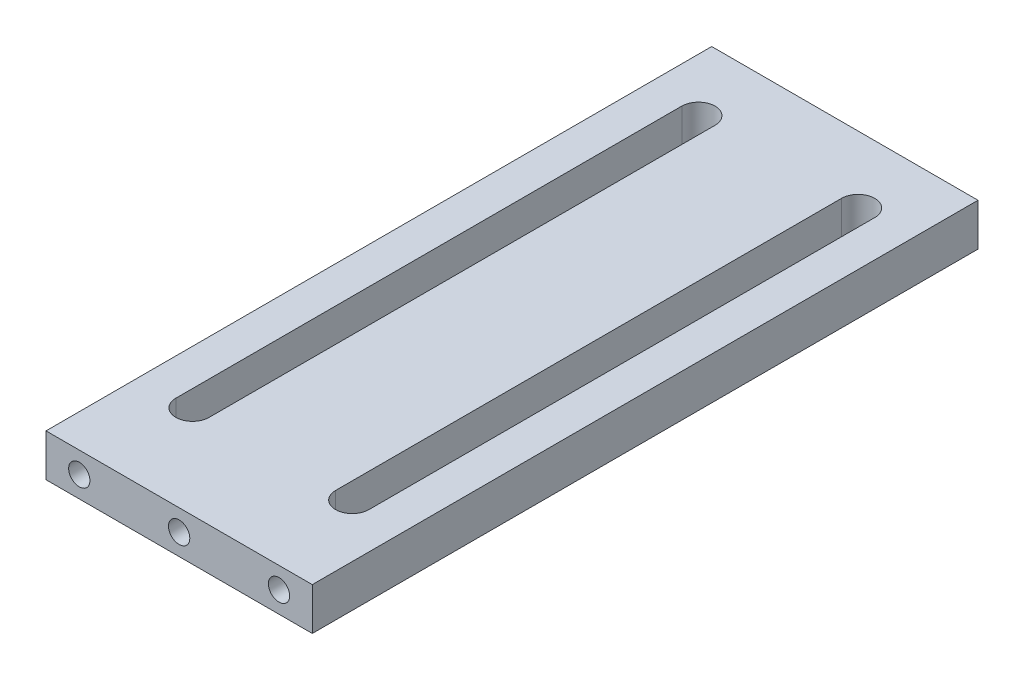
ISO-10303-21;
HEADER;
FILE_DESCRIPTION(('STEP AP214'),'2;1');
FILE_NAME('part.step','',(''),(''),'','','');
FILE_SCHEMA(('AUTOMOTIVE_DESIGN { 1 0 10303 214 1 1 1 1 }'));
ENDSEC;
DATA;
#1=APPLICATION_CONTEXT('core data for automotive mechanical design processes');
#2=APPLICATION_PROTOCOL_DEFINITION('international standard','automotive_design',2000,#1);
#3=PRODUCT_CONTEXT('',#1,'mechanical');
#4=PRODUCT('Part','Part','',(#3));
#5=PRODUCT_RELATED_PRODUCT_CATEGORY('part','',(#4));
#6=PRODUCT_DEFINITION_FORMATION('','',#4);
#7=PRODUCT_DEFINITION_CONTEXT('part definition',#1,'design');
#8=PRODUCT_DEFINITION('design','',#6,#7);
#9=PRODUCT_DEFINITION_SHAPE('','',#8);
#10=(LENGTH_UNIT() NAMED_UNIT(*) SI_UNIT(.MILLI.,.METRE.));
#11=(NAMED_UNIT(*) PLANE_ANGLE_UNIT() SI_UNIT($,.RADIAN.));
#12=(NAMED_UNIT(*) SI_UNIT($,.STERADIAN.) SOLID_ANGLE_UNIT());
#13=UNCERTAINTY_MEASURE_WITH_UNIT(LENGTH_MEASURE(1.E-05),#10,'distance_accuracy_value','');
#14=(GEOMETRIC_REPRESENTATION_CONTEXT(3) GLOBAL_UNCERTAINTY_ASSIGNED_CONTEXT((#13)) GLOBAL_UNIT_ASSIGNED_CONTEXT((#10,
#11,#12)) REPRESENTATION_CONTEXT('',''));
#15=CARTESIAN_POINT('',(0.,0.,0.));
#16=DIRECTION('',(0.,0.,1.));
#17=DIRECTION('',(1.,0.,0.));
#18=AXIS2_PLACEMENT_3D('',#15,#16,#17);
#19=CARTESIAN_POINT('',(0.,3.18,0.));
#20=DIRECTION('',(0.,-1.,0.));
#21=DIRECTION('',(0.,0.,-1.));
#22=AXIS2_PLACEMENT_3D('',#19,#20,#21);
#23=PLANE('',#22);
#24=DIRECTION('',(0.,0.,1.));
#25=VECTOR('',#24,1.);
#26=CARTESIAN_POINT('',(0.,3.18,0.));
#27=LINE('',#26,#25);
#28=CARTESIAN_POINT('',(0.,3.18,-50.));
#29=VERTEX_POINT('',#28);
#30=CARTESIAN_POINT('',(0.,3.18,0.));
#31=VERTEX_POINT('',#30);
#32=EDGE_CURVE('E197',#29,#31,#27,.T.);
#33=ORIENTED_EDGE('',*,*,#32,.T.);
#34=DIRECTION('',(1.,0.,0.));
#35=VECTOR('',#34,1.);
#36=CARTESIAN_POINT('',(0.,3.18,0.));
#37=LINE('',#36,#35);
#38=CARTESIAN_POINT('',(20.,3.18,0.));
#39=VERTEX_POINT('',#38);
#40=EDGE_CURVE('E200',#31,#39,#37,.T.);
#41=ORIENTED_EDGE('',*,*,#40,.T.);
#42=DIRECTION('',(0.,0.,-1.));
#43=VECTOR('',#42,1.);
#44=CARTESIAN_POINT('',(20.,3.18,0.));
#45=LINE('',#44,#43);
#46=CARTESIAN_POINT('',(20.,3.18,-50.));
#47=VERTEX_POINT('',#46);
#48=EDGE_CURVE('E203',#39,#47,#45,.T.);
#49=ORIENTED_EDGE('',*,*,#48,.T.);
#50=DIRECTION('',(-1.,0.,0.));
#51=VECTOR('',#50,1.);
#52=CARTESIAN_POINT('',(0.,3.18,-50.));
#53=LINE('',#52,#51);
#54=EDGE_CURVE('E205',#47,#29,#53,.T.);
#55=ORIENTED_EDGE('',*,*,#54,.T.);
#56=EDGE_LOOP('',(#33,#41,#49,#55));
#57=FACE_BOUND('',#56,.T.);
#58=DIRECTION('',(0.,0.,-1.));
#59=VECTOR('',#58,1.);
#60=CARTESIAN_POINT('',(5.25,3.18,-7.));
#61=LINE('',#60,#59);
#62=CARTESIAN_POINT('',(5.25,3.18,-7.));
#63=VERTEX_POINT('',#62);
#64=CARTESIAN_POINT('',(5.25,3.18,-45.));
#65=VERTEX_POINT('',#64);
#66=EDGE_CURVE('E180',#63,#65,#61,.T.);
#67=ORIENTED_EDGE('',*,*,#66,.F.);
#68=CARTESIAN_POINT('',(4.00000000000001,3.18,-7.));
#69=DIRECTION('',(0.,1.,0.));
#70=DIRECTION('',(0.,0.,1.));
#71=AXIS2_PLACEMENT_3D('',#68,#69,#70);
#72=CIRCLE('',#71,1.25);
#73=CARTESIAN_POINT('',(2.75000000000001,3.18,-7.));
#74=VERTEX_POINT('',#73);
#75=EDGE_CURVE('E161',#74,#63,#72,.T.);
#76=ORIENTED_EDGE('',*,*,#75,.F.);
#77=DIRECTION('',(0.,0.,1.));
#78=VECTOR('',#77,1.);
#79=CARTESIAN_POINT('',(2.75000000000001,3.18,-7.));
#80=LINE('',#79,#78);
#81=CARTESIAN_POINT('',(2.75,3.18,-45.));
#82=VERTEX_POINT('',#81);
#83=EDGE_CURVE('E169',#82,#74,#80,.T.);
#84=ORIENTED_EDGE('',*,*,#83,.F.);
#85=CARTESIAN_POINT('',(4.,3.18,-45.));
#86=DIRECTION('',(0.,1.,0.));
#87=DIRECTION('',(0.,0.,1.));
#88=AXIS2_PLACEMENT_3D('',#85,#86,#87);
#89=CIRCLE('',#88,1.25);
#90=EDGE_CURVE('E183',#65,#82,#89,.T.);
#91=ORIENTED_EDGE('',*,*,#90,.F.);
#92=EDGE_LOOP('',(#67,#76,#84,#91));
#93=FACE_BOUND('',#92,.T.);
#94=CARTESIAN_POINT('',(16.,3.18,-7.));
#95=DIRECTION('',(0.,-1.,0.));
#96=DIRECTION('',(0.,0.,1.));
#97=AXIS2_PLACEMENT_3D('',#94,#95,#96);
#98=CIRCLE('',#97,1.25);
#99=CARTESIAN_POINT('',(17.25,3.18,-7.));
#100=VERTEX_POINT('',#99);
#101=CARTESIAN_POINT('',(14.75,3.18,-7.));
#102=VERTEX_POINT('',#101);
#103=EDGE_CURVE('E52',#100,#102,#98,.T.);
#104=ORIENTED_EDGE('',*,*,#103,.T.);
#105=DIRECTION('',(0.,0.,-1.));
#106=VECTOR('',#105,1.);
#107=CARTESIAN_POINT('',(14.75,3.18,-7.));
#108=LINE('',#107,#106);
#109=CARTESIAN_POINT('',(14.75,3.18,-45.));
#110=VERTEX_POINT('',#109);
#111=EDGE_CURVE('E142',#102,#110,#108,.T.);
#112=ORIENTED_EDGE('',*,*,#111,.T.);
#113=CARTESIAN_POINT('',(16.,3.18,-45.));
#114=DIRECTION('',(0.,-1.,0.));
#115=DIRECTION('',(0.,0.,1.));
#116=AXIS2_PLACEMENT_3D('',#113,#114,#115);
#117=CIRCLE('',#116,1.25);
#118=CARTESIAN_POINT('',(17.25,3.18,-45.));
#119=VERTEX_POINT('',#118);
#120=EDGE_CURVE('E145',#110,#119,#117,.T.);
#121=ORIENTED_EDGE('',*,*,#120,.T.);
#122=DIRECTION('',(0.,0.,1.));
#123=VECTOR('',#122,1.);
#124=CARTESIAN_POINT('',(17.25,3.18,-7.));
#125=LINE('',#124,#123);
#126=EDGE_CURVE('E154',#119,#100,#125,.T.);
#127=ORIENTED_EDGE('',*,*,#126,.T.);
#128=EDGE_LOOP('',(#104,#112,#121,#127));
#129=FACE_BOUND('',#128,.T.);
#130=ADVANCED_FACE('F37',(#57,#93,#129),#23,.F.);
#131=CARTESIAN_POINT('',(0.,0.,0.));
#132=DIRECTION('',(0.,-1.,0.));
#133=DIRECTION('',(0.,0.,-1.));
#134=AXIS2_PLACEMENT_3D('',#131,#132,#133);
#135=PLANE('',#134);
#136=CARTESIAN_POINT('',(4.00000000000001,0.,-7.));
#137=DIRECTION('',(0.,1.,0.));
#138=DIRECTION('',(0.,0.,1.));
#139=AXIS2_PLACEMENT_3D('',#136,#137,#138);
#140=CIRCLE('',#139,1.25);
#141=CARTESIAN_POINT('',(2.75000000000001,0.,-7.));
#142=VERTEX_POINT('',#141);
#143=CARTESIAN_POINT('',(5.25,0.,-7.));
#144=VERTEX_POINT('',#143);
#145=EDGE_CURVE('E165',#142,#144,#140,.T.);
#146=ORIENTED_EDGE('',*,*,#145,.T.);
#147=DIRECTION('',(0.,0.,-1.));
#148=VECTOR('',#147,1.);
#149=CARTESIAN_POINT('',(5.25,0.,-7.));
#150=LINE('',#149,#148);
#151=CARTESIAN_POINT('',(5.25,0.,-45.));
#152=VERTEX_POINT('',#151);
#153=EDGE_CURVE('E168',#144,#152,#150,.T.);
#154=ORIENTED_EDGE('',*,*,#153,.T.);
#155=CARTESIAN_POINT('',(4.,0.,-45.));
#156=DIRECTION('',(0.,1.,0.));
#157=DIRECTION('',(0.,0.,1.));
#158=AXIS2_PLACEMENT_3D('',#155,#156,#157);
#159=CIRCLE('',#158,1.25);
#160=CARTESIAN_POINT('',(2.75,0.,-45.));
#161=VERTEX_POINT('',#160);
#162=EDGE_CURVE('E172',#152,#161,#159,.T.);
#163=ORIENTED_EDGE('',*,*,#162,.T.);
#164=DIRECTION('',(0.,0.,1.));
#165=VECTOR('',#164,1.);
#166=CARTESIAN_POINT('',(2.75000000000001,0.,-7.));
#167=LINE('',#166,#165);
#168=EDGE_CURVE('E175',#161,#142,#167,.T.);
#169=ORIENTED_EDGE('',*,*,#168,.T.);
#170=EDGE_LOOP('',(#146,#154,#163,#169));
#171=FACE_BOUND('',#170,.T.);
#172=DIRECTION('',(0.,0.,1.));
#173=VECTOR('',#172,1.);
#174=CARTESIAN_POINT('',(0.,0.,0.));
#175=LINE('',#174,#173);
#176=CARTESIAN_POINT('',(0.,0.,-50.));
#177=VERTEX_POINT('',#176);
#178=CARTESIAN_POINT('',(0.,0.,0.));
#179=VERTEX_POINT('',#178);
#180=EDGE_CURVE('E190',#177,#179,#175,.T.);
#181=ORIENTED_EDGE('',*,*,#180,.F.);
#182=DIRECTION('',(-1.,0.,0.));
#183=VECTOR('',#182,1.);
#184=CARTESIAN_POINT('',(0.,0.,-50.));
#185=LINE('',#184,#183);
#186=CARTESIAN_POINT('',(20.,0.,-50.));
#187=VERTEX_POINT('',#186);
#188=EDGE_CURVE('E201',#187,#177,#185,.T.);
#189=ORIENTED_EDGE('',*,*,#188,.F.);
#190=DIRECTION('',(0.,0.,-1.));
#191=VECTOR('',#190,1.);
#192=CARTESIAN_POINT('',(20.,0.,0.));
#193=LINE('',#192,#191);
#194=CARTESIAN_POINT('',(20.,0.,0.));
#195=VERTEX_POINT('',#194);
#196=EDGE_CURVE('E212',#195,#187,#193,.T.);
#197=ORIENTED_EDGE('',*,*,#196,.F.);
#198=DIRECTION('',(1.,0.,0.));
#199=VECTOR('',#198,1.);
#200=CARTESIAN_POINT('',(0.,0.,0.));
#201=LINE('',#200,#199);
#202=EDGE_CURVE('E210',#179,#195,#201,.T.);
#203=ORIENTED_EDGE('',*,*,#202,.F.);
#204=EDGE_LOOP('',(#181,#189,#197,#203));
#205=FACE_BOUND('',#204,.T.);
#206=DIRECTION('',(0.,0.,-1.));
#207=VECTOR('',#206,1.);
#208=CARTESIAN_POINT('',(14.75,0.,-7.));
#209=LINE('',#208,#207);
#210=CARTESIAN_POINT('',(14.75,0.,-7.));
#211=VERTEX_POINT('',#210);
#212=CARTESIAN_POINT('',(14.75,0.,-45.));
#213=VERTEX_POINT('',#212);
#214=EDGE_CURVE('E138',#211,#213,#209,.T.);
#215=ORIENTED_EDGE('',*,*,#214,.F.);
#216=CARTESIAN_POINT('',(16.,0.,-7.));
#217=DIRECTION('',(0.,-1.,0.));
#218=DIRECTION('',(0.,0.,1.));
#219=AXIS2_PLACEMENT_3D('',#216,#217,#218);
#220=CIRCLE('',#219,1.25);
#221=CARTESIAN_POINT('',(17.25,0.,-7.));
#222=VERTEX_POINT('',#221);
#223=EDGE_CURVE('E134',#222,#211,#220,.T.);
#224=ORIENTED_EDGE('',*,*,#223,.F.);
#225=DIRECTION('',(0.,0.,1.));
#226=VECTOR('',#225,1.);
#227=CARTESIAN_POINT('',(17.25,0.,-7.));
#228=LINE('',#227,#226);
#229=CARTESIAN_POINT('',(17.25,0.,-45.));
#230=VERTEX_POINT('',#229);
#231=EDGE_CURVE('E126',#230,#222,#228,.T.);
#232=ORIENTED_EDGE('',*,*,#231,.F.);
#233=CARTESIAN_POINT('',(16.,0.,-45.));
#234=DIRECTION('',(0.,-1.,0.));
#235=DIRECTION('',(0.,0.,1.));
#236=AXIS2_PLACEMENT_3D('',#233,#234,#235);
#237=CIRCLE('',#236,1.25);
#238=EDGE_CURVE('E133',#213,#230,#237,.T.);
#239=ORIENTED_EDGE('',*,*,#238,.F.);
#240=EDGE_LOOP('',(#215,#224,#232,#239));
#241=FACE_BOUND('',#240,.T.);
#242=ADVANCED_FACE('F141',(#171,#205,#241),#135,.T.);
#243=CARTESIAN_POINT('',(0.,3.18,0.));
#244=DIRECTION('',(1.,0.,0.));
#245=DIRECTION('',(0.,0.,-1.));
#246=AXIS2_PLACEMENT_3D('',#243,#244,#245);
#247=PLANE('',#246);
#248=ORIENTED_EDGE('',*,*,#180,.T.);
#249=DIRECTION('',(0.,-1.,0.));
#250=VECTOR('',#249,1.);
#251=CARTESIAN_POINT('',(0.,3.18,0.));
#252=LINE('',#251,#250);
#253=EDGE_CURVE('E11',#31,#179,#252,.T.);
#254=ORIENTED_EDGE('',*,*,#253,.F.);
#255=ORIENTED_EDGE('',*,*,#32,.F.);
#256=DIRECTION('',(0.,-1.,0.));
#257=VECTOR('',#256,1.);
#258=CARTESIAN_POINT('',(0.,3.18,-50.));
#259=LINE('',#258,#257);
#260=EDGE_CURVE('E207',#29,#177,#259,.T.);
#261=ORIENTED_EDGE('',*,*,#260,.T.);
#262=EDGE_LOOP('',(#248,#254,#255,#261));
#263=FACE_BOUND('',#262,.T.);
#264=ADVANCED_FACE('F39',(#263),#247,.F.);
#265=CARTESIAN_POINT('',(0.,3.18,0.));
#266=DIRECTION('',(0.,0.,-1.));
#267=DIRECTION('',(-1.,0.,0.));
#268=AXIS2_PLACEMENT_3D('',#265,#266,#267);
#269=PLANE('',#268);
#270=CARTESIAN_POINT('',(17.5,1.59,0.));
#271=DIRECTION('',(0.,0.,1.));
#272=DIRECTION('',(1.,0.,0.));
#273=AXIS2_PLACEMENT_3D('',#270,#271,#272);
#274=CIRCLE('',#273,0.799999999999999);
#275=CARTESIAN_POINT('',(18.3,1.59,0.));
#276=VERTEX_POINT('',#275);
#277=EDGE_CURVE('E336',#276,#276,#274,.T.);
#278=ORIENTED_EDGE('',*,*,#277,.F.);
#279=EDGE_LOOP('',(#278));
#280=FACE_BOUND('',#279,.T.);
#281=CARTESIAN_POINT('',(2.5,1.59,0.));
#282=DIRECTION('',(0.,0.,1.));
#283=DIRECTION('',(1.,0.,0.));
#284=AXIS2_PLACEMENT_3D('',#281,#282,#283);
#285=CIRCLE('',#284,0.8);
#286=CARTESIAN_POINT('',(3.3,1.59,0.));
#287=VERTEX_POINT('',#286);
#288=EDGE_CURVE('E333',#287,#287,#285,.T.);
#289=ORIENTED_EDGE('',*,*,#288,.F.);
#290=EDGE_LOOP('',(#289));
#291=FACE_BOUND('',#290,.T.);
#292=CARTESIAN_POINT('',(10.,1.59,0.));
#293=DIRECTION('',(0.,0.,1.));
#294=DIRECTION('',(1.,0.,0.));
#295=AXIS2_PLACEMENT_3D('',#292,#293,#294);
#296=CIRCLE('',#295,0.800000000000001);
#297=CARTESIAN_POINT('',(10.8,1.59,0.));
#298=VERTEX_POINT('',#297);
#299=EDGE_CURVE('E148',#298,#298,#296,.T.);
#300=ORIENTED_EDGE('',*,*,#299,.F.);
#301=EDGE_LOOP('',(#300));
#302=FACE_BOUND('',#301,.T.);
#303=ORIENTED_EDGE('',*,*,#202,.T.);
#304=DIRECTION('',(0.,-1.,0.));
#305=VECTOR('',#304,1.);
#306=CARTESIAN_POINT('',(20.,3.18,0.));
#307=LINE('',#306,#305);
#308=EDGE_CURVE('E45',#39,#195,#307,.T.);
#309=ORIENTED_EDGE('',*,*,#308,.F.);
#310=ORIENTED_EDGE('',*,*,#40,.F.);
#311=ORIENTED_EDGE('',*,*,#253,.T.);
#312=EDGE_LOOP('',(#303,#309,#310,#311));
#313=FACE_BOUND('',#312,.T.);
#314=ADVANCED_FACE('F239',(#280,#291,#302,#313),#269,.F.);
#315=CARTESIAN_POINT('',(20.,3.18,0.));
#316=DIRECTION('',(-1.,0.,0.));
#317=DIRECTION('',(0.,0.,1.));
#318=AXIS2_PLACEMENT_3D('',#315,#316,#317);
#319=PLANE('',#318);
#320=ORIENTED_EDGE('',*,*,#196,.T.);
#321=DIRECTION('',(0.,-1.,0.));
#322=VECTOR('',#321,1.);
#323=CARTESIAN_POINT('',(20.,3.18,-50.));
#324=LINE('',#323,#322);
#325=EDGE_CURVE('E217',#47,#187,#324,.T.);
#326=ORIENTED_EDGE('',*,*,#325,.F.);
#327=ORIENTED_EDGE('',*,*,#48,.F.);
#328=ORIENTED_EDGE('',*,*,#308,.T.);
#329=EDGE_LOOP('',(#320,#326,#327,#328));
#330=FACE_BOUND('',#329,.T.);
#331=ADVANCED_FACE('F224',(#330),#319,.F.);
#332=CARTESIAN_POINT('',(0.,3.18,-50.));
#333=DIRECTION('',(0.,0.,1.));
#334=DIRECTION('',(1.,0.,0.));
#335=AXIS2_PLACEMENT_3D('',#332,#333,#334);
#336=PLANE('',#335);
#337=ORIENTED_EDGE('',*,*,#188,.T.);
#338=ORIENTED_EDGE('',*,*,#260,.F.);
#339=ORIENTED_EDGE('',*,*,#54,.F.);
#340=ORIENTED_EDGE('',*,*,#325,.T.);
#341=EDGE_LOOP('',(#337,#338,#339,#340));
#342=FACE_BOUND('',#341,.T.);
#343=ADVANCED_FACE('F232',(#342),#336,.F.);
#344=CARTESIAN_POINT('',(4.00000000000001,0.,-7.));
#345=DIRECTION('',(0.,1.,0.));
#346=DIRECTION('',(0.,0.,1.));
#347=AXIS2_PLACEMENT_3D('',#344,#345,#346);
#348=CYLINDRICAL_SURFACE('',#347,1.25);
#349=ORIENTED_EDGE('',*,*,#75,.T.);
#350=DIRECTION('',(0.,1.,0.));
#351=VECTOR('',#350,1.);
#352=CARTESIAN_POINT('',(5.25,0.,-7.));
#353=LINE('',#352,#351);
#354=EDGE_CURVE('E178',#144,#63,#353,.T.);
#355=ORIENTED_EDGE('',*,*,#354,.F.);
#356=ORIENTED_EDGE('',*,*,#145,.F.);
#357=DIRECTION('',(0.,1.,0.));
#358=VECTOR('',#357,1.);
#359=CARTESIAN_POINT('',(2.75000000000001,0.,-7.));
#360=LINE('',#359,#358);
#361=EDGE_CURVE('E188',#142,#74,#360,.T.);
#362=ORIENTED_EDGE('',*,*,#361,.T.);
#363=EDGE_LOOP('',(#349,#355,#356,#362));
#364=FACE_BOUND('',#363,.T.);
#365=ADVANCED_FACE('F257',(#364),#348,.F.);
#366=CARTESIAN_POINT('',(2.75000000000001,0.,-7.));
#367=DIRECTION('',(-1.,0.,0.));
#368=DIRECTION('',(0.,0.,1.));
#369=AXIS2_PLACEMENT_3D('',#366,#367,#368);
#370=PLANE('',#369);
#371=ORIENTED_EDGE('',*,*,#83,.T.);
#372=ORIENTED_EDGE('',*,*,#361,.F.);
#373=ORIENTED_EDGE('',*,*,#168,.F.);
#374=DIRECTION('',(0.,1.,0.));
#375=VECTOR('',#374,1.);
#376=CARTESIAN_POINT('',(2.75,0.,-45.));
#377=LINE('',#376,#375);
#378=EDGE_CURVE('E191',#161,#82,#377,.T.);
#379=ORIENTED_EDGE('',*,*,#378,.T.);
#380=EDGE_LOOP('',(#371,#372,#373,#379));
#381=FACE_BOUND('',#380,.T.);
#382=ADVANCED_FACE('F264',(#381),#370,.F.);
#383=CARTESIAN_POINT('',(4.,0.,-45.));
#384=DIRECTION('',(0.,1.,0.));
#385=DIRECTION('',(0.,0.,1.));
#386=AXIS2_PLACEMENT_3D('',#383,#384,#385);
#387=CYLINDRICAL_SURFACE('',#386,1.25);
#388=ORIENTED_EDGE('',*,*,#90,.T.);
#389=ORIENTED_EDGE('',*,*,#378,.F.);
#390=ORIENTED_EDGE('',*,*,#162,.F.);
#391=DIRECTION('',(0.,1.,0.));
#392=VECTOR('',#391,1.);
#393=CARTESIAN_POINT('',(5.25,0.,-45.));
#394=LINE('',#393,#392);
#395=EDGE_CURVE('E193',#152,#65,#394,.T.);
#396=ORIENTED_EDGE('',*,*,#395,.T.);
#397=EDGE_LOOP('',(#388,#389,#390,#396));
#398=FACE_BOUND('',#397,.T.);
#399=ADVANCED_FACE('F269',(#398),#387,.F.);
#400=CARTESIAN_POINT('',(5.25,0.,-7.));
#401=DIRECTION('',(1.,0.,0.));
#402=DIRECTION('',(0.,0.,-1.));
#403=AXIS2_PLACEMENT_3D('',#400,#401,#402);
#404=PLANE('',#403);
#405=ORIENTED_EDGE('',*,*,#66,.T.);
#406=ORIENTED_EDGE('',*,*,#395,.F.);
#407=ORIENTED_EDGE('',*,*,#153,.F.);
#408=ORIENTED_EDGE('',*,*,#354,.T.);
#409=EDGE_LOOP('',(#405,#406,#407,#408));
#410=FACE_BOUND('',#409,.T.);
#411=ADVANCED_FACE('F278',(#410),#404,.F.);
#412=CARTESIAN_POINT('',(16.,0.,-7.));
#413=DIRECTION('',(0.,1.,0.));
#414=DIRECTION('',(0.,0.,1.));
#415=AXIS2_PLACEMENT_3D('',#412,#413,#414);
#416=CYLINDRICAL_SURFACE('',#415,1.25);
#417=ORIENTED_EDGE('',*,*,#103,.F.);
#418=DIRECTION('',(0.,1.,0.));
#419=VECTOR('',#418,1.);
#420=CARTESIAN_POINT('',(17.25,0.,-7.));
#421=LINE('',#420,#419);
#422=EDGE_CURVE('E128',#222,#100,#421,.T.);
#423=ORIENTED_EDGE('',*,*,#422,.F.);
#424=ORIENTED_EDGE('',*,*,#223,.T.);
#425=DIRECTION('',(0.,1.,0.));
#426=VECTOR('',#425,1.);
#427=CARTESIAN_POINT('',(14.75,0.,-7.));
#428=LINE('',#427,#426);
#429=EDGE_CURVE('E159',#211,#102,#428,.T.);
#430=ORIENTED_EDGE('',*,*,#429,.T.);
#431=EDGE_LOOP('',(#417,#423,#424,#430));
#432=FACE_BOUND('',#431,.T.);
#433=ADVANCED_FACE('F136',(#432),#416,.F.);
#434=CARTESIAN_POINT('',(14.75,0.,-7.));
#435=DIRECTION('',(1.,0.,0.));
#436=DIRECTION('',(0.,0.,-1.));
#437=AXIS2_PLACEMENT_3D('',#434,#435,#436);
#438=PLANE('',#437);
#439=ORIENTED_EDGE('',*,*,#111,.F.);
#440=ORIENTED_EDGE('',*,*,#429,.F.);
#441=ORIENTED_EDGE('',*,*,#214,.T.);
#442=DIRECTION('',(0.,1.,0.));
#443=VECTOR('',#442,1.);
#444=CARTESIAN_POINT('',(14.75,0.,-45.));
#445=LINE('',#444,#443);
#446=EDGE_CURVE('E162',#213,#110,#445,.T.);
#447=ORIENTED_EDGE('',*,*,#446,.T.);
#448=EDGE_LOOP('',(#439,#440,#441,#447));
#449=FACE_BOUND('',#448,.T.);
#450=ADVANCED_FACE('F292',(#449),#438,.T.);
#451=CARTESIAN_POINT('',(16.,0.,-45.));
#452=DIRECTION('',(0.,1.,0.));
#453=DIRECTION('',(0.,0.,1.));
#454=AXIS2_PLACEMENT_3D('',#451,#452,#453);
#455=CYLINDRICAL_SURFACE('',#454,1.25);
#456=ORIENTED_EDGE('',*,*,#120,.F.);
#457=ORIENTED_EDGE('',*,*,#446,.F.);
#458=ORIENTED_EDGE('',*,*,#238,.T.);
#459=DIRECTION('',(0.,1.,0.));
#460=VECTOR('',#459,1.);
#461=CARTESIAN_POINT('',(17.25,0.,-45.));
#462=LINE('',#461,#460);
#463=EDGE_CURVE('E60',#230,#119,#462,.T.);
#464=ORIENTED_EDGE('',*,*,#463,.T.);
#465=EDGE_LOOP('',(#456,#457,#458,#464));
#466=FACE_BOUND('',#465,.T.);
#467=ADVANCED_FACE('F296',(#466),#455,.F.);
#468=CARTESIAN_POINT('',(17.25,0.,-7.));
#469=DIRECTION('',(-1.,0.,0.));
#470=DIRECTION('',(0.,0.,1.));
#471=AXIS2_PLACEMENT_3D('',#468,#469,#470);
#472=PLANE('',#471);
#473=ORIENTED_EDGE('',*,*,#126,.F.);
#474=ORIENTED_EDGE('',*,*,#463,.F.);
#475=ORIENTED_EDGE('',*,*,#231,.T.);
#476=ORIENTED_EDGE('',*,*,#422,.T.);
#477=EDGE_LOOP('',(#473,#474,#475,#476));
#478=FACE_BOUND('',#477,.T.);
#479=ADVANCED_FACE('F127',(#478),#472,.T.);
#480=CARTESIAN_POINT('',(10.,1.59,-4.));
#481=DIRECTION('',(0.,0.,1.));
#482=DIRECTION('',(1.,0.,0.));
#483=AXIS2_PLACEMENT_3D('',#480,#481,#482);
#484=CYLINDRICAL_SURFACE('',#483,0.800000000000001);
#485=CARTESIAN_POINT('',(10.,1.59,-4.));
#486=DIRECTION('',(0.,0.,1.));
#487=DIRECTION('',(1.,0.,0.));
#488=AXIS2_PLACEMENT_3D('',#485,#486,#487);
#489=CIRCLE('',#488,0.800000000000001);
#490=CARTESIAN_POINT('',(10.8,1.59,-4.));
#491=VERTEX_POINT('',#490);
#492=EDGE_CURVE('E155',#491,#491,#489,.T.);
#493=ORIENTED_EDGE('',*,*,#492,.F.);
#494=EDGE_LOOP('',(#493));
#495=FACE_BOUND('',#494,.T.);
#496=ORIENTED_EDGE('',*,*,#299,.T.);
#497=EDGE_LOOP('',(#496));
#498=FACE_BOUND('',#497,.T.);
#499=ADVANCED_FACE('F295',(#495,#498),#484,.F.);
#500=CARTESIAN_POINT('',(10.,1.59,-4.));
#501=DIRECTION('',(0.,0.,1.));
#502=DIRECTION('',(1.,0.,0.));
#503=AXIS2_PLACEMENT_3D('',#500,#501,#502);
#504=PLANE('',#503);
#505=ORIENTED_EDGE('',*,*,#492,.T.);
#506=EDGE_LOOP('',(#505));
#507=FACE_BOUND('',#506,.T.);
#508=ADVANCED_FACE('F305',(#507),#504,.T.);
#509=CARTESIAN_POINT('',(2.5,1.59,-4.));
#510=DIRECTION('',(0.,0.,1.));
#511=DIRECTION('',(1.,0.,0.));
#512=AXIS2_PLACEMENT_3D('',#509,#510,#511);
#513=CYLINDRICAL_SURFACE('',#512,0.8);
#514=CARTESIAN_POINT('',(2.5,1.59,-4.));
#515=DIRECTION('',(0.,0.,1.));
#516=DIRECTION('',(1.,0.,0.));
#517=AXIS2_PLACEMENT_3D('',#514,#515,#516);
#518=CIRCLE('',#517,0.8);
#519=CARTESIAN_POINT('',(3.3,1.59,-4.));
#520=VERTEX_POINT('',#519);
#521=EDGE_CURVE('E330',#520,#520,#518,.T.);
#522=ORIENTED_EDGE('',*,*,#521,.F.);
#523=EDGE_LOOP('',(#522));
#524=FACE_BOUND('',#523,.T.);
#525=ORIENTED_EDGE('',*,*,#288,.T.);
#526=EDGE_LOOP('',(#525));
#527=FACE_BOUND('',#526,.T.);
#528=ADVANCED_FACE('F309',(#524,#527),#513,.F.);
#529=CARTESIAN_POINT('',(2.5,1.59,-4.));
#530=DIRECTION('',(0.,0.,1.));
#531=DIRECTION('',(1.,0.,0.));
#532=AXIS2_PLACEMENT_3D('',#529,#530,#531);
#533=PLANE('',#532);
#534=ORIENTED_EDGE('',*,*,#521,.T.);
#535=EDGE_LOOP('',(#534));
#536=FACE_BOUND('',#535,.T.);
#537=ADVANCED_FACE('F318',(#536),#533,.T.);
#538=CARTESIAN_POINT('',(17.5,1.59,-4.));
#539=DIRECTION('',(0.,0.,1.));
#540=DIRECTION('',(1.,0.,0.));
#541=AXIS2_PLACEMENT_3D('',#538,#539,#540);
#542=CYLINDRICAL_SURFACE('',#541,0.799999999999999);
#543=CARTESIAN_POINT('',(17.5,1.59,-4.));
#544=DIRECTION('',(0.,0.,1.));
#545=DIRECTION('',(1.,0.,0.));
#546=AXIS2_PLACEMENT_3D('',#543,#544,#545);
#547=CIRCLE('',#546,0.799999999999999);
#548=CARTESIAN_POINT('',(18.3,1.59,-4.));
#549=VERTEX_POINT('',#548);
#550=EDGE_CURVE('E341',#549,#549,#547,.T.);
#551=ORIENTED_EDGE('',*,*,#550,.F.);
#552=EDGE_LOOP('',(#551));
#553=FACE_BOUND('',#552,.T.);
#554=ORIENTED_EDGE('',*,*,#277,.T.);
#555=EDGE_LOOP('',(#554));
#556=FACE_BOUND('',#555,.T.);
#557=ADVANCED_FACE('F314',(#553,#556),#542,.F.);
#558=CARTESIAN_POINT('',(17.5,1.59,-4.));
#559=DIRECTION('',(0.,0.,1.));
#560=DIRECTION('',(1.,0.,0.));
#561=AXIS2_PLACEMENT_3D('',#558,#559,#560);
#562=PLANE('',#561);
#563=ORIENTED_EDGE('',*,*,#550,.T.);
#564=EDGE_LOOP('',(#563));
#565=FACE_BOUND('',#564,.T.);
#566=ADVANCED_FACE('F311',(#565),#562,.T.);
#567=CLOSED_SHELL('',(#130,#242,#264,#314,#331,#343,#365,#382,#399,#411,#433,#450,#467,#479,
#499,#508,#528,#537,#557,#566));
#568=MANIFOLD_SOLID_BREP('B2',#567);
#569=ADVANCED_BREP_SHAPE_REPRESENTATION('',(#18,#568),#14);
#570=SHAPE_DEFINITION_REPRESENTATION(#9,#569);
ENDSEC;
END-ISO-10303-21;
